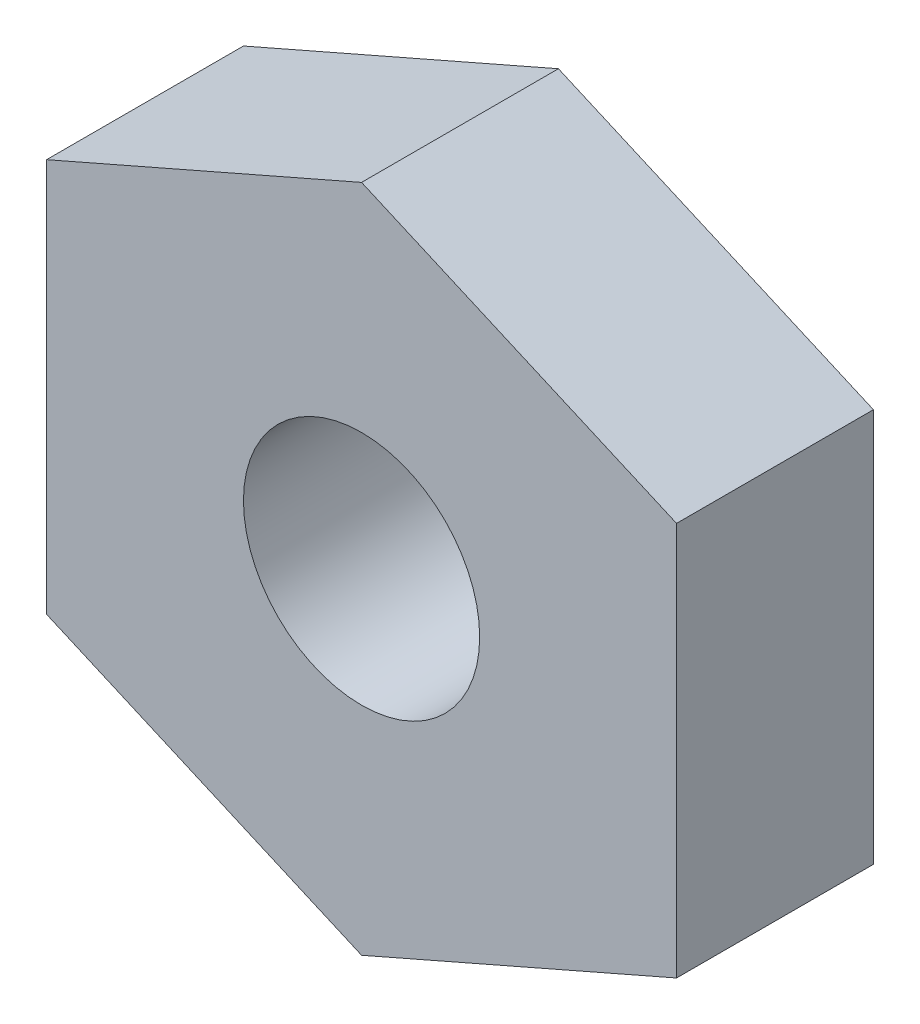
ISO-10303-21;
HEADER;
FILE_DESCRIPTION(('STEP AP214'),'2;1');
FILE_NAME('part.step','',(''),(''),'','','');
FILE_SCHEMA(('AUTOMOTIVE_DESIGN { 1 0 10303 214 1 1 1 1 }'));
ENDSEC;
DATA;
#1=APPLICATION_CONTEXT('core data for automotive mechanical design processes');
#2=APPLICATION_PROTOCOL_DEFINITION('international standard','automotive_design',2000,#1);
#3=PRODUCT_CONTEXT('',#1,'mechanical');
#4=PRODUCT('Part','Part','',(#3));
#5=PRODUCT_RELATED_PRODUCT_CATEGORY('part','',(#4));
#6=PRODUCT_DEFINITION_FORMATION('','',#4);
#7=PRODUCT_DEFINITION_CONTEXT('part definition',#1,'design');
#8=PRODUCT_DEFINITION('design','',#6,#7);
#9=PRODUCT_DEFINITION_SHAPE('','',#8);
#10=(LENGTH_UNIT() NAMED_UNIT(*) SI_UNIT(.MILLI.,.METRE.));
#11=(NAMED_UNIT(*) PLANE_ANGLE_UNIT() SI_UNIT($,.RADIAN.));
#12=(NAMED_UNIT(*) SI_UNIT($,.STERADIAN.) SOLID_ANGLE_UNIT());
#13=UNCERTAINTY_MEASURE_WITH_UNIT(LENGTH_MEASURE(1.E-05),#10,'distance_accuracy_value','');
#14=(GEOMETRIC_REPRESENTATION_CONTEXT(3) GLOBAL_UNCERTAINTY_ASSIGNED_CONTEXT((#13)) GLOBAL_UNIT_ASSIGNED_CONTEXT((#10,
#11,#12)) REPRESENTATION_CONTEXT('',''));
#15=CARTESIAN_POINT('',(0.,0.,0.));
#16=DIRECTION('',(0.,0.,1.));
#17=DIRECTION('',(1.,0.,0.));
#18=AXIS2_PLACEMENT_3D('',#15,#16,#17);
#19=CARTESIAN_POINT('',(-31.0407194618066,-4.25,2.5));
#20=DIRECTION('',(0.400818834019708,0.916157334902189,0.));
#21=DIRECTION('',(-0.916157334902189,0.400818834019708,0.));
#22=AXIS2_PLACEMENT_3D('',#19,#20,#21);
#23=PLANE('',#22);
#24=DIRECTION('',(0.916157334902189,-0.400818834019708,0.));
#25=VECTOR('',#24,1.);
#26=CARTESIAN_POINT('',(-31.0407194618066,-4.25,0.));
#27=LINE('',#26,#25);
#28=CARTESIAN_POINT('',(-35.0407194618066,-2.5,0.));
#29=VERTEX_POINT('',#28);
#30=CARTESIAN_POINT('',(-31.0407194618066,-4.25,0.));
#31=VERTEX_POINT('',#30);
#32=EDGE_CURVE('E121',#29,#31,#27,.T.);
#33=ORIENTED_EDGE('',*,*,#32,.T.);
#34=DIRECTION('',(0.,0.,-1.));
#35=VECTOR('',#34,1.);
#36=CARTESIAN_POINT('',(-31.0407194618066,-4.25,2.5));
#37=LINE('',#36,#35);
#38=CARTESIAN_POINT('',(-31.0407194618066,-4.25,2.5));
#39=VERTEX_POINT('',#38);
#40=EDGE_CURVE('E41',#39,#31,#37,.T.);
#41=ORIENTED_EDGE('',*,*,#40,.F.);
#42=DIRECTION('',(0.916157334902189,-0.400818834019708,0.));
#43=VECTOR('',#42,1.);
#44=CARTESIAN_POINT('',(-31.0407194618066,-4.25,2.5));
#45=LINE('',#44,#43);
#46=CARTESIAN_POINT('',(-35.0407194618066,-2.5,2.5));
#47=VERTEX_POINT('',#46);
#48=EDGE_CURVE('E87',#47,#39,#45,.T.);
#49=ORIENTED_EDGE('',*,*,#48,.F.);
#50=DIRECTION('',(0.,0.,-1.));
#51=VECTOR('',#50,1.);
#52=CARTESIAN_POINT('',(-35.0407194618066,-2.5,2.5));
#53=LINE('',#52,#51);
#54=EDGE_CURVE('E11',#47,#29,#53,.T.);
#55=ORIENTED_EDGE('',*,*,#54,.T.);
#56=EDGE_LOOP('',(#33,#41,#49,#55));
#57=FACE_BOUND('',#56,.T.);
#58=ADVANCED_FACE('F33',(#57),#23,.F.);
#59=CARTESIAN_POINT('',(-31.0407194618066,-4.25,2.5));
#60=DIRECTION('',(-0.400818834019708,0.916157334902189,0.));
#61=DIRECTION('',(-0.916157334902189,-0.400818834019708,0.));
#62=AXIS2_PLACEMENT_3D('',#59,#60,#61);
#63=PLANE('',#62);
#64=DIRECTION('',(0.916157334902189,0.400818834019708,0.));
#65=VECTOR('',#64,1.);
#66=CARTESIAN_POINT('',(-31.0407194618066,-4.25,0.));
#67=LINE('',#66,#65);
#68=CARTESIAN_POINT('',(-27.0407194618066,-2.5,0.));
#69=VERTEX_POINT('',#68);
#70=EDGE_CURVE('E123',#31,#69,#67,.T.);
#71=ORIENTED_EDGE('',*,*,#70,.T.);
#72=DIRECTION('',(0.,0.,-1.));
#73=VECTOR('',#72,1.);
#74=CARTESIAN_POINT('',(-27.0407194618066,-2.5,2.5));
#75=LINE('',#74,#73);
#76=CARTESIAN_POINT('',(-27.0407194618066,-2.5,2.5));
#77=VERTEX_POINT('',#76);
#78=EDGE_CURVE('E110',#77,#69,#75,.T.);
#79=ORIENTED_EDGE('',*,*,#78,.F.);
#80=DIRECTION('',(0.916157334902189,0.400818834019708,0.));
#81=VECTOR('',#80,1.);
#82=CARTESIAN_POINT('',(-31.0407194618066,-4.25,2.5));
#83=LINE('',#82,#81);
#84=EDGE_CURVE('E101',#39,#77,#83,.T.);
#85=ORIENTED_EDGE('',*,*,#84,.F.);
#86=ORIENTED_EDGE('',*,*,#40,.T.);
#87=EDGE_LOOP('',(#71,#79,#85,#86));
#88=FACE_BOUND('',#87,.T.);
#89=ADVANCED_FACE('F136',(#88),#63,.F.);
#90=CARTESIAN_POINT('',(-27.0407194618066,-2.5,2.5));
#91=DIRECTION('',(-1.,0.,0.));
#92=DIRECTION('',(0.,0.,1.));
#93=AXIS2_PLACEMENT_3D('',#90,#91,#92);
#94=PLANE('',#93);
#95=DIRECTION('',(0.,1.,0.));
#96=VECTOR('',#95,1.);
#97=CARTESIAN_POINT('',(-27.0407194618066,-2.5,0.));
#98=LINE('',#97,#96);
#99=CARTESIAN_POINT('',(-27.0407194618066,2.5,0.));
#100=VERTEX_POINT('',#99);
#101=EDGE_CURVE('E109',#69,#100,#98,.T.);
#102=ORIENTED_EDGE('',*,*,#101,.T.);
#103=DIRECTION('',(0.,0.,-1.));
#104=VECTOR('',#103,1.);
#105=CARTESIAN_POINT('',(-27.0407194618066,2.5,2.5));
#106=LINE('',#105,#104);
#107=CARTESIAN_POINT('',(-27.0407194618066,2.5,2.5));
#108=VERTEX_POINT('',#107);
#109=EDGE_CURVE('E106',#108,#100,#106,.T.);
#110=ORIENTED_EDGE('',*,*,#109,.F.);
#111=DIRECTION('',(0.,1.,0.));
#112=VECTOR('',#111,1.);
#113=CARTESIAN_POINT('',(-27.0407194618066,-2.5,2.5));
#114=LINE('',#113,#112);
#115=EDGE_CURVE('E95',#77,#108,#114,.T.);
#116=ORIENTED_EDGE('',*,*,#115,.F.);
#117=ORIENTED_EDGE('',*,*,#78,.T.);
#118=EDGE_LOOP('',(#102,#110,#116,#117));
#119=FACE_BOUND('',#118,.T.);
#120=ADVANCED_FACE('F107',(#119),#94,.F.);
#121=CARTESIAN_POINT('',(-31.0407194618066,4.25,2.5));
#122=DIRECTION('',(-0.400818834019708,-0.916157334902189,0.));
#123=DIRECTION('',(0.916157334902189,-0.400818834019708,0.));
#124=AXIS2_PLACEMENT_3D('',#121,#122,#123);
#125=PLANE('',#124);
#126=DIRECTION('',(-0.916157334902189,0.400818834019708,0.));
#127=VECTOR('',#126,1.);
#128=CARTESIAN_POINT('',(-31.0407194618066,4.25,0.));
#129=LINE('',#128,#127);
#130=CARTESIAN_POINT('',(-31.0407194618066,4.25,0.));
#131=VERTEX_POINT('',#130);
#132=EDGE_CURVE('E73',#100,#131,#129,.T.);
#133=ORIENTED_EDGE('',*,*,#132,.T.);
#134=DIRECTION('',(0.,0.,-1.));
#135=VECTOR('',#134,1.);
#136=CARTESIAN_POINT('',(-31.0407194618066,4.25,2.5));
#137=LINE('',#136,#135);
#138=CARTESIAN_POINT('',(-31.0407194618066,4.25,2.5));
#139=VERTEX_POINT('',#138);
#140=EDGE_CURVE('E111',#139,#131,#137,.T.);
#141=ORIENTED_EDGE('',*,*,#140,.F.);
#142=DIRECTION('',(-0.916157334902189,0.400818834019708,0.));
#143=VECTOR('',#142,1.);
#144=CARTESIAN_POINT('',(-31.0407194618066,4.25,2.5));
#145=LINE('',#144,#143);
#146=EDGE_CURVE('E99',#108,#139,#145,.T.);
#147=ORIENTED_EDGE('',*,*,#146,.F.);
#148=ORIENTED_EDGE('',*,*,#109,.T.);
#149=EDGE_LOOP('',(#133,#141,#147,#148));
#150=FACE_BOUND('',#149,.T.);
#151=ADVANCED_FACE('F113',(#150),#125,.F.);
#152=CARTESIAN_POINT('',(-31.0407194618066,4.25,2.5));
#153=DIRECTION('',(0.400818834019708,-0.916157334902189,0.));
#154=DIRECTION('',(0.916157334902189,0.400818834019708,0.));
#155=AXIS2_PLACEMENT_3D('',#152,#153,#154);
#156=PLANE('',#155);
#157=DIRECTION('',(-0.916157334902189,-0.400818834019708,0.));
#158=VECTOR('',#157,1.);
#159=CARTESIAN_POINT('',(-31.0407194618066,4.25,0.));
#160=LINE('',#159,#158);
#161=CARTESIAN_POINT('',(-35.0407194618066,2.5,0.));
#162=VERTEX_POINT('',#161);
#163=EDGE_CURVE('E80',#131,#162,#160,.T.);
#164=ORIENTED_EDGE('',*,*,#163,.T.);
#165=DIRECTION('',(0.,0.,-1.));
#166=VECTOR('',#165,1.);
#167=CARTESIAN_POINT('',(-35.0407194618066,2.5,2.5));
#168=LINE('',#167,#166);
#169=CARTESIAN_POINT('',(-35.0407194618066,2.5,2.5));
#170=VERTEX_POINT('',#169);
#171=EDGE_CURVE('E117',#170,#162,#168,.T.);
#172=ORIENTED_EDGE('',*,*,#171,.F.);
#173=DIRECTION('',(-0.916157334902189,-0.400818834019708,0.));
#174=VECTOR('',#173,1.);
#175=CARTESIAN_POINT('',(-31.0407194618066,4.25,2.5));
#176=LINE('',#175,#174);
#177=EDGE_CURVE('E115',#139,#170,#176,.T.);
#178=ORIENTED_EDGE('',*,*,#177,.F.);
#179=ORIENTED_EDGE('',*,*,#140,.T.);
#180=EDGE_LOOP('',(#164,#172,#178,#179));
#181=FACE_BOUND('',#180,.T.);
#182=ADVANCED_FACE('F142',(#181),#156,.F.);
#183=CARTESIAN_POINT('',(-35.0407194618066,0.,2.5));
#184=DIRECTION('',(1.,0.,0.));
#185=DIRECTION('',(0.,0.,-1.));
#186=AXIS2_PLACEMENT_3D('',#183,#184,#185);
#187=PLANE('',#186);
#188=DIRECTION('',(0.,-1.,0.));
#189=VECTOR('',#188,1.);
#190=CARTESIAN_POINT('',(-35.0407194618066,0.,0.));
#191=LINE('',#190,#189);
#192=EDGE_CURVE('E129',#162,#29,#191,.T.);
#193=ORIENTED_EDGE('',*,*,#192,.T.);
#194=ORIENTED_EDGE('',*,*,#54,.F.);
#195=DIRECTION('',(0.,-1.,0.));
#196=VECTOR('',#195,1.);
#197=CARTESIAN_POINT('',(-35.0407194618066,0.,2.5));
#198=LINE('',#197,#196);
#199=EDGE_CURVE('E49',#170,#47,#198,.T.);
#200=ORIENTED_EDGE('',*,*,#199,.F.);
#201=ORIENTED_EDGE('',*,*,#171,.T.);
#202=EDGE_LOOP('',(#193,#194,#200,#201));
#203=FACE_BOUND('',#202,.T.);
#204=ADVANCED_FACE('F141',(#203),#187,.F.);
#205=CARTESIAN_POINT('',(0.,0.,2.5));
#206=DIRECTION('',(0.,0.,-1.));
#207=DIRECTION('',(-1.,0.,0.));
#208=AXIS2_PLACEMENT_3D('',#205,#206,#207);
#209=PLANE('',#208);
#210=CARTESIAN_POINT('',(-31.0407194618066,0.,2.5));
#211=DIRECTION('',(0.,0.,1.));
#212=DIRECTION('',(1.,0.,0.));
#213=AXIS2_PLACEMENT_3D('',#210,#211,#212);
#214=CIRCLE('',#213,1.5);
#215=CARTESIAN_POINT('',(-29.5407194618066,0.,2.5));
#216=VERTEX_POINT('',#215);
#217=EDGE_CURVE('E146',#216,#216,#214,.T.);
#218=ORIENTED_EDGE('',*,*,#217,.F.);
#219=EDGE_LOOP('',(#218));
#220=FACE_BOUND('',#219,.T.);
#221=ORIENTED_EDGE('',*,*,#199,.T.);
#222=ORIENTED_EDGE('',*,*,#48,.T.);
#223=ORIENTED_EDGE('',*,*,#84,.T.);
#224=ORIENTED_EDGE('',*,*,#115,.T.);
#225=ORIENTED_EDGE('',*,*,#146,.T.);
#226=ORIENTED_EDGE('',*,*,#177,.T.);
#227=EDGE_LOOP('',(#221,#222,#223,#224,#225,#226));
#228=FACE_BOUND('',#227,.T.);
#229=ADVANCED_FACE('F97',(#220,#228),#209,.F.);
#230=CARTESIAN_POINT('',(0.,0.,0.));
#231=DIRECTION('',(0.,0.,-1.));
#232=DIRECTION('',(-1.,0.,0.));
#233=AXIS2_PLACEMENT_3D('',#230,#231,#232);
#234=PLANE('',#233);
#235=CARTESIAN_POINT('',(-31.0407194618066,0.,0.));
#236=DIRECTION('',(0.,0.,1.));
#237=DIRECTION('',(1.,0.,0.));
#238=AXIS2_PLACEMENT_3D('',#235,#236,#237);
#239=CIRCLE('',#238,1.5);
#240=CARTESIAN_POINT('',(-29.5407194618066,0.,0.));
#241=VERTEX_POINT('',#240);
#242=EDGE_CURVE('E124',#241,#241,#239,.T.);
#243=ORIENTED_EDGE('',*,*,#242,.T.);
#244=EDGE_LOOP('',(#243));
#245=FACE_BOUND('',#244,.T.);
#246=ORIENTED_EDGE('',*,*,#32,.F.);
#247=ORIENTED_EDGE('',*,*,#192,.F.);
#248=ORIENTED_EDGE('',*,*,#163,.F.);
#249=ORIENTED_EDGE('',*,*,#132,.F.);
#250=ORIENTED_EDGE('',*,*,#101,.F.);
#251=ORIENTED_EDGE('',*,*,#70,.F.);
#252=EDGE_LOOP('',(#246,#247,#248,#249,#250,#251));
#253=FACE_BOUND('',#252,.T.);
#254=ADVANCED_FACE('F139',(#245,#253),#234,.T.);
#255=CARTESIAN_POINT('',(-31.0407194618066,0.,0.));
#256=DIRECTION('',(0.,0.,1.));
#257=DIRECTION('',(1.,0.,0.));
#258=AXIS2_PLACEMENT_3D('',#255,#256,#257);
#259=CYLINDRICAL_SURFACE('',#258,1.5);
#260=ORIENTED_EDGE('',*,*,#242,.F.);
#261=EDGE_LOOP('',(#260));
#262=FACE_BOUND('',#261,.T.);
#263=ORIENTED_EDGE('',*,*,#217,.T.);
#264=EDGE_LOOP('',(#263));
#265=FACE_BOUND('',#264,.T.);
#266=ADVANCED_FACE('F153',(#262,#265),#259,.F.);
#267=CLOSED_SHELL('',(#58,#89,#120,#151,#182,#204,#229,#254,#266));
#268=MANIFOLD_SOLID_BREP('B2',#267);
#269=ADVANCED_BREP_SHAPE_REPRESENTATION('',(#18,#268),#14);
#270=SHAPE_DEFINITION_REPRESENTATION(#9,#269);
ENDSEC;
END-ISO-10303-21;
